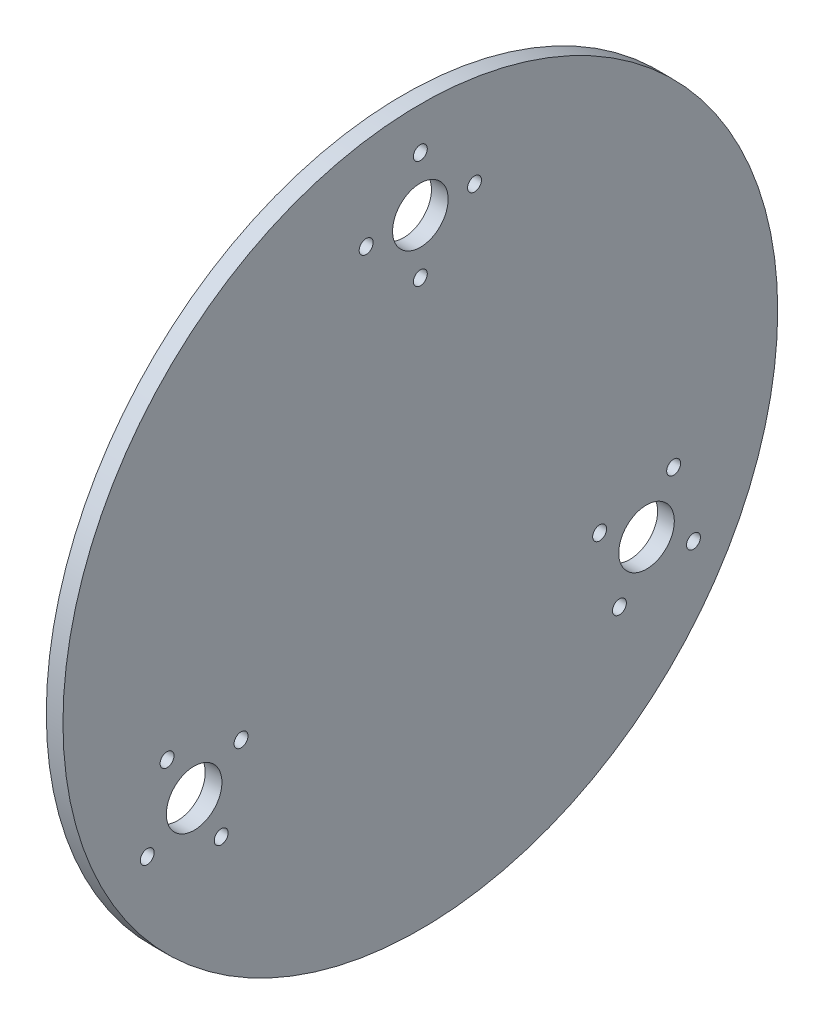
ISO-10303-21;
HEADER;
FILE_DESCRIPTION(('STEP AP214'),'2;1');
FILE_NAME('part.step','',(''),(''),'','','');
FILE_SCHEMA(('AUTOMOTIVE_DESIGN { 1 0 10303 214 1 1 1 1 }'));
ENDSEC;
DATA;
#1=APPLICATION_CONTEXT('core data for automotive mechanical design processes');
#2=APPLICATION_PROTOCOL_DEFINITION('international standard','automotive_design',2000,#1);
#3=PRODUCT_CONTEXT('',#1,'mechanical');
#4=PRODUCT('Part','Part','',(#3));
#5=PRODUCT_RELATED_PRODUCT_CATEGORY('part','',(#4));
#6=PRODUCT_DEFINITION_FORMATION('','',#4);
#7=PRODUCT_DEFINITION_CONTEXT('part definition',#1,'design');
#8=PRODUCT_DEFINITION('design','',#6,#7);
#9=PRODUCT_DEFINITION_SHAPE('','',#8);
#10=(LENGTH_UNIT() NAMED_UNIT(*) SI_UNIT(.MILLI.,.METRE.));
#11=(NAMED_UNIT(*) PLANE_ANGLE_UNIT() SI_UNIT($,.RADIAN.));
#12=(NAMED_UNIT(*) SI_UNIT($,.STERADIAN.) SOLID_ANGLE_UNIT());
#13=UNCERTAINTY_MEASURE_WITH_UNIT(LENGTH_MEASURE(1.E-05),#10,'distance_accuracy_value','');
#14=(GEOMETRIC_REPRESENTATION_CONTEXT(3) GLOBAL_UNCERTAINTY_ASSIGNED_CONTEXT((#13)) GLOBAL_UNIT_ASSIGNED_CONTEXT((#10,
#11,#12)) REPRESENTATION_CONTEXT('',''));
#15=CARTESIAN_POINT('',(0.,0.,0.));
#16=DIRECTION('',(0.,0.,1.));
#17=DIRECTION('',(1.,0.,0.));
#18=AXIS2_PLACEMENT_3D('',#15,#16,#17);
#19=CARTESIAN_POINT('',(3.,0.,0.));
#20=DIRECTION('',(1.,0.,0.));
#21=DIRECTION('',(0.,0.,-1.));
#22=AXIS2_PLACEMENT_3D('',#19,#20,#21);
#23=PLANE('',#22);
#24=CARTESIAN_POINT('',(3.,-18.6250000000015,32.2594462909677));
#25=DIRECTION('',(1.,0.,0.));
#26=DIRECTION('',(0.,0.,-1.));
#27=AXIS2_PLACEMENT_3D('',#24,#25,#26);
#28=CIRCLE('',#27,1.25);
#29=CARTESIAN_POINT('',(3.,-18.6250000000015,31.0094462909677));
#30=VERTEX_POINT('',#29);
#31=EDGE_CURVE('E123',#30,#30,#28,.T.);
#32=ORIENTED_EDGE('',*,*,#31,.F.);
#33=EDGE_LOOP('',(#32));
#34=FACE_BOUND('',#33,.T.);
#35=CARTESIAN_POINT('',(3.,-28.3750000000015,49.1469416647642));
#36=DIRECTION('',(1.,0.,0.));
#37=DIRECTION('',(0.,0.,-1.));
#38=AXIS2_PLACEMENT_3D('',#35,#36,#37);
#39=CIRCLE('',#38,1.25);
#40=CARTESIAN_POINT('',(3.,-28.3750000000015,47.8969416647642));
#41=VERTEX_POINT('',#40);
#42=EDGE_CURVE('E111',#41,#41,#39,.T.);
#43=ORIENTED_EDGE('',*,*,#42,.F.);
#44=EDGE_LOOP('',(#43));
#45=FACE_BOUND('',#44,.T.);
#46=CARTESIAN_POINT('',(3.,-15.0562523131002,-45.5781939778713));
#47=DIRECTION('',(1.,0.,0.));
#48=DIRECTION('',(0.,0.,-1.));
#49=AXIS2_PLACEMENT_3D('',#46,#47,#48);
#50=CIRCLE('',#49,1.25);
#51=CARTESIAN_POINT('',(3.,-15.0562523131002,-46.8281939778713));
#52=VERTEX_POINT('',#51);
#53=EDGE_CURVE('E99',#52,#52,#50,.T.);
#54=ORIENTED_EDGE('',*,*,#53,.F.);
#55=EDGE_LOOP('',(#54));
#56=FACE_BOUND('',#55,.T.);
#57=CARTESIAN_POINT('',(3.,47.,9.75));
#58=DIRECTION('',(1.,0.,0.));
#59=DIRECTION('',(0.,0.,-1.));
#60=AXIS2_PLACEMENT_3D('',#57,#58,#59);
#61=CIRCLE('',#60,1.25);
#62=CARTESIAN_POINT('',(3.,47.,8.5));
#63=VERTEX_POINT('',#62);
#64=EDGE_CURVE('E87',#63,#63,#61,.T.);
#65=ORIENTED_EDGE('',*,*,#64,.F.);
#66=EDGE_LOOP('',(#65));
#67=FACE_BOUND('',#66,.T.);
#68=CARTESIAN_POINT('',(3.,47.,-9.75));
#69=DIRECTION('',(1.,0.,0.));
#70=DIRECTION('',(0.,0.,-1.));
#71=AXIS2_PLACEMENT_3D('',#68,#69,#70);
#72=CIRCLE('',#71,1.25);
#73=CARTESIAN_POINT('',(3.,47.,-11.));
#74=VERTEX_POINT('',#73);
#75=EDGE_CURVE('E75',#74,#74,#72,.T.);
#76=ORIENTED_EDGE('',*,*,#75,.F.);
#77=EDGE_LOOP('',(#76));
#78=FACE_BOUND('',#77,.T.);
#79=CARTESIAN_POINT('',(3.,-28.3749999999985,-49.1469416647695));
#80=DIRECTION('',(1.,0.,0.));
#81=DIRECTION('',(0.,0.,-1.));
#82=AXIS2_PLACEMENT_3D('',#79,#80,#81);
#83=CIRCLE('',#82,1.25);
#84=CARTESIAN_POINT('',(3.,-28.3749999999985,-50.3969416647695));
#85=VERTEX_POINT('',#84);
#86=EDGE_CURVE('E63',#85,#85,#83,.T.);
#87=ORIENTED_EDGE('',*,*,#86,.F.);
#88=EDGE_LOOP('',(#87));
#89=FACE_BOUND('',#88,.T.);
#90=CARTESIAN_POINT('',(3.,-23.4999999999985,-40.7031939778713));
#91=DIRECTION('',(1.,0.,0.));
#92=DIRECTION('',(0.,0.,-1.));
#93=AXIS2_PLACEMENT_3D('',#90,#91,#92);
#94=CIRCLE('',#93,5.);
#95=CARTESIAN_POINT('',(3.,-23.4999999999985,-45.7031939778713));
#96=VERTEX_POINT('',#95);
#97=EDGE_CURVE('E51',#96,#96,#94,.T.);
#98=ORIENTED_EDGE('',*,*,#97,.F.);
#99=EDGE_LOOP('',(#98));
#100=FACE_BOUND('',#99,.T.);
#101=CARTESIAN_POINT('',(3.,0.,0.));
#102=DIRECTION('',(1.,0.,0.));
#103=DIRECTION('',(0.,0.,-1.));
#104=AXIS2_PLACEMENT_3D('',#101,#102,#103);
#105=CIRCLE('',#104,64.3085896706992);
#106=CARTESIAN_POINT('',(3.,0.,-64.3085896706992));
#107=VERTEX_POINT('',#106);
#108=EDGE_CURVE('E10',#107,#107,#105,.T.);
#109=ORIENTED_EDGE('',*,*,#108,.T.);
#110=EDGE_LOOP('',(#109));
#111=FACE_BOUND('',#110,.T.);
#112=CARTESIAN_POINT('',(3.,47.,0.));
#113=DIRECTION('',(1.,0.,0.));
#114=DIRECTION('',(0.,0.,-1.));
#115=AXIS2_PLACEMENT_3D('',#112,#113,#114);
#116=CIRCLE('',#115,5.);
#117=CARTESIAN_POINT('',(3.,47.,-5.));
#118=VERTEX_POINT('',#117);
#119=EDGE_CURVE('E46',#118,#118,#116,.T.);
#120=ORIENTED_EDGE('',*,*,#119,.F.);
#121=EDGE_LOOP('',(#120));
#122=FACE_BOUND('',#121,.T.);
#123=CARTESIAN_POINT('',(3.,56.75,0.));
#124=DIRECTION('',(1.,0.,0.));
#125=DIRECTION('',(0.,0.,-1.));
#126=AXIS2_PLACEMENT_3D('',#123,#124,#125);
#127=CIRCLE('',#126,1.25);
#128=CARTESIAN_POINT('',(3.,56.75,-1.25));
#129=VERTEX_POINT('',#128);
#130=EDGE_CURVE('E57',#129,#129,#127,.T.);
#131=ORIENTED_EDGE('',*,*,#130,.F.);
#132=EDGE_LOOP('',(#131));
#133=FACE_BOUND('',#132,.T.);
#134=CARTESIAN_POINT('',(3.,-31.9437476868968,-35.8281939778713));
#135=DIRECTION('',(1.,0.,0.));
#136=DIRECTION('',(0.,0.,-1.));
#137=AXIS2_PLACEMENT_3D('',#134,#135,#136);
#138=CIRCLE('',#137,1.25);
#139=CARTESIAN_POINT('',(3.,-31.9437476868968,-37.0781939778713));
#140=VERTEX_POINT('',#139);
#141=EDGE_CURVE('E69',#140,#140,#138,.T.);
#142=ORIENTED_EDGE('',*,*,#141,.F.);
#143=EDGE_LOOP('',(#142));
#144=FACE_BOUND('',#143,.T.);
#145=CARTESIAN_POINT('',(3.,37.25,0.));
#146=DIRECTION('',(1.,0.,0.));
#147=DIRECTION('',(0.,0.,-1.));
#148=AXIS2_PLACEMENT_3D('',#145,#146,#147);
#149=CIRCLE('',#148,1.25);
#150=CARTESIAN_POINT('',(3.,37.25,-1.25));
#151=VERTEX_POINT('',#150);
#152=EDGE_CURVE('E81',#151,#151,#149,.T.);
#153=ORIENTED_EDGE('',*,*,#152,.F.);
#154=EDGE_LOOP('',(#153));
#155=FACE_BOUND('',#154,.T.);
#156=CARTESIAN_POINT('',(3.,-18.6249999999985,-32.259446290973));
#157=DIRECTION('',(1.,0.,0.));
#158=DIRECTION('',(0.,0.,-1.));
#159=AXIS2_PLACEMENT_3D('',#156,#157,#158);
#160=CIRCLE('',#159,1.25);
#161=CARTESIAN_POINT('',(3.,-18.6249999999985,-33.509446290973));
#162=VERTEX_POINT('',#161);
#163=EDGE_CURVE('E93',#162,#162,#160,.T.);
#164=ORIENTED_EDGE('',*,*,#163,.F.);
#165=EDGE_LOOP('',(#164));
#166=FACE_BOUND('',#165,.T.);
#167=CARTESIAN_POINT('',(3.,-23.5000000000015,40.703193977866));
#168=DIRECTION('',(1.,0.,0.));
#169=DIRECTION('',(0.,0.,-1.));
#170=AXIS2_PLACEMENT_3D('',#167,#168,#169);
#171=CIRCLE('',#170,5.);
#172=CARTESIAN_POINT('',(3.,-23.5000000000015,35.703193977866));
#173=VERTEX_POINT('',#172);
#174=EDGE_CURVE('E105',#173,#173,#171,.T.);
#175=ORIENTED_EDGE('',*,*,#174,.F.);
#176=EDGE_LOOP('',(#175));
#177=FACE_BOUND('',#176,.T.);
#178=CARTESIAN_POINT('',(3.,-15.0562523131033,45.578193977866));
#179=DIRECTION('',(1.,0.,0.));
#180=DIRECTION('',(0.,0.,-1.));
#181=AXIS2_PLACEMENT_3D('',#178,#179,#180);
#182=CIRCLE('',#181,1.25000000000001);
#183=CARTESIAN_POINT('',(3.,-15.0562523131033,44.328193977866));
#184=VERTEX_POINT('',#183);
#185=EDGE_CURVE('E117',#184,#184,#182,.T.);
#186=ORIENTED_EDGE('',*,*,#185,.F.);
#187=EDGE_LOOP('',(#186));
#188=FACE_BOUND('',#187,.T.);
#189=CARTESIAN_POINT('',(3.,-31.9437476868998,35.828193977866));
#190=DIRECTION('',(1.,0.,0.));
#191=DIRECTION('',(0.,0.,-1.));
#192=AXIS2_PLACEMENT_3D('',#189,#190,#191);
#193=CIRCLE('',#192,1.25);
#194=CARTESIAN_POINT('',(3.,-31.9437476868998,34.578193977866));
#195=VERTEX_POINT('',#194);
#196=EDGE_CURVE('E129',#195,#195,#193,.T.);
#197=ORIENTED_EDGE('',*,*,#196,.F.);
#198=EDGE_LOOP('',(#197));
#199=FACE_BOUND('',#198,.T.);
#200=ADVANCED_FACE('F35',(#34,#45,#56,#67,#78,#89,#100,#111,#122,#133,#144,#155,#166,#177,#188,
#199),#23,.T.);
#201=CARTESIAN_POINT('',(0.,0.,0.));
#202=DIRECTION('',(1.,0.,0.));
#203=DIRECTION('',(0.,0.,-1.));
#204=AXIS2_PLACEMENT_3D('',#201,#202,#203);
#205=PLANE('',#204);
#206=CARTESIAN_POINT('',(0.,0.,0.));
#207=DIRECTION('',(1.,0.,0.));
#208=DIRECTION('',(0.,0.,-1.));
#209=AXIS2_PLACEMENT_3D('',#206,#207,#208);
#210=CIRCLE('',#209,64.3085896706992);
#211=CARTESIAN_POINT('',(0.,0.,-64.3085896706992));
#212=VERTEX_POINT('',#211);
#213=EDGE_CURVE('E39',#212,#212,#210,.T.);
#214=ORIENTED_EDGE('',*,*,#213,.F.);
#215=EDGE_LOOP('',(#214));
#216=FACE_BOUND('',#215,.T.);
#217=CARTESIAN_POINT('',(0.,47.,0.));
#218=DIRECTION('',(1.,0.,0.));
#219=DIRECTION('',(0.,0.,-1.));
#220=AXIS2_PLACEMENT_3D('',#217,#218,#219);
#221=CIRCLE('',#220,5.);
#222=CARTESIAN_POINT('',(0.,47.,-5.));
#223=VERTEX_POINT('',#222);
#224=EDGE_CURVE('E48',#223,#223,#221,.T.);
#225=ORIENTED_EDGE('',*,*,#224,.T.);
#226=EDGE_LOOP('',(#225));
#227=FACE_BOUND('',#226,.T.);
#228=CARTESIAN_POINT('',(0.,-23.4999999999985,-40.7031939778713));
#229=DIRECTION('',(1.,0.,0.));
#230=DIRECTION('',(0.,0.,-1.));
#231=AXIS2_PLACEMENT_3D('',#228,#229,#230);
#232=CIRCLE('',#231,5.);
#233=CARTESIAN_POINT('',(0.,-23.4999999999985,-45.7031939778713));
#234=VERTEX_POINT('',#233);
#235=EDGE_CURVE('E54',#234,#234,#232,.T.);
#236=ORIENTED_EDGE('',*,*,#235,.T.);
#237=EDGE_LOOP('',(#236));
#238=FACE_BOUND('',#237,.T.);
#239=CARTESIAN_POINT('',(0.,56.75,0.));
#240=DIRECTION('',(1.,0.,0.));
#241=DIRECTION('',(0.,0.,-1.));
#242=AXIS2_PLACEMENT_3D('',#239,#240,#241);
#243=CIRCLE('',#242,1.25);
#244=CARTESIAN_POINT('',(0.,56.75,-1.25));
#245=VERTEX_POINT('',#244);
#246=EDGE_CURVE('E60',#245,#245,#243,.T.);
#247=ORIENTED_EDGE('',*,*,#246,.T.);
#248=EDGE_LOOP('',(#247));
#249=FACE_BOUND('',#248,.T.);
#250=CARTESIAN_POINT('',(0.,-28.3749999999985,-49.1469416647695));
#251=DIRECTION('',(1.,0.,0.));
#252=DIRECTION('',(0.,0.,-1.));
#253=AXIS2_PLACEMENT_3D('',#250,#251,#252);
#254=CIRCLE('',#253,1.25);
#255=CARTESIAN_POINT('',(0.,-28.3749999999985,-50.3969416647695));
#256=VERTEX_POINT('',#255);
#257=EDGE_CURVE('E66',#256,#256,#254,.T.);
#258=ORIENTED_EDGE('',*,*,#257,.T.);
#259=EDGE_LOOP('',(#258));
#260=FACE_BOUND('',#259,.T.);
#261=CARTESIAN_POINT('',(0.,-31.9437476868968,-35.8281939778713));
#262=DIRECTION('',(1.,0.,0.));
#263=DIRECTION('',(0.,0.,-1.));
#264=AXIS2_PLACEMENT_3D('',#261,#262,#263);
#265=CIRCLE('',#264,1.25);
#266=CARTESIAN_POINT('',(0.,-31.9437476868968,-37.0781939778713));
#267=VERTEX_POINT('',#266);
#268=EDGE_CURVE('E72',#267,#267,#265,.T.);
#269=ORIENTED_EDGE('',*,*,#268,.T.);
#270=EDGE_LOOP('',(#269));
#271=FACE_BOUND('',#270,.T.);
#272=CARTESIAN_POINT('',(0.,47.,-9.75));
#273=DIRECTION('',(1.,0.,0.));
#274=DIRECTION('',(0.,0.,-1.));
#275=AXIS2_PLACEMENT_3D('',#272,#273,#274);
#276=CIRCLE('',#275,1.25);
#277=CARTESIAN_POINT('',(0.,47.,-11.));
#278=VERTEX_POINT('',#277);
#279=EDGE_CURVE('E78',#278,#278,#276,.T.);
#280=ORIENTED_EDGE('',*,*,#279,.T.);
#281=EDGE_LOOP('',(#280));
#282=FACE_BOUND('',#281,.T.);
#283=CARTESIAN_POINT('',(0.,37.25,0.));
#284=DIRECTION('',(1.,0.,0.));
#285=DIRECTION('',(0.,0.,-1.));
#286=AXIS2_PLACEMENT_3D('',#283,#284,#285);
#287=CIRCLE('',#286,1.25);
#288=CARTESIAN_POINT('',(0.,37.25,-1.25));
#289=VERTEX_POINT('',#288);
#290=EDGE_CURVE('E84',#289,#289,#287,.T.);
#291=ORIENTED_EDGE('',*,*,#290,.T.);
#292=EDGE_LOOP('',(#291));
#293=FACE_BOUND('',#292,.T.);
#294=CARTESIAN_POINT('',(0.,47.,9.75));
#295=DIRECTION('',(1.,0.,0.));
#296=DIRECTION('',(0.,0.,-1.));
#297=AXIS2_PLACEMENT_3D('',#294,#295,#296);
#298=CIRCLE('',#297,1.25);
#299=CARTESIAN_POINT('',(0.,47.,8.5));
#300=VERTEX_POINT('',#299);
#301=EDGE_CURVE('E90',#300,#300,#298,.T.);
#302=ORIENTED_EDGE('',*,*,#301,.T.);
#303=EDGE_LOOP('',(#302));
#304=FACE_BOUND('',#303,.T.);
#305=CARTESIAN_POINT('',(0.,-18.6249999999985,-32.259446290973));
#306=DIRECTION('',(1.,0.,0.));
#307=DIRECTION('',(0.,0.,-1.));
#308=AXIS2_PLACEMENT_3D('',#305,#306,#307);
#309=CIRCLE('',#308,1.25);
#310=CARTESIAN_POINT('',(0.,-18.6249999999985,-33.509446290973));
#311=VERTEX_POINT('',#310);
#312=EDGE_CURVE('E96',#311,#311,#309,.T.);
#313=ORIENTED_EDGE('',*,*,#312,.T.);
#314=EDGE_LOOP('',(#313));
#315=FACE_BOUND('',#314,.T.);
#316=CARTESIAN_POINT('',(0.,-15.0562523131002,-45.5781939778713));
#317=DIRECTION('',(1.,0.,0.));
#318=DIRECTION('',(0.,0.,-1.));
#319=AXIS2_PLACEMENT_3D('',#316,#317,#318);
#320=CIRCLE('',#319,1.25);
#321=CARTESIAN_POINT('',(0.,-15.0562523131002,-46.8281939778713));
#322=VERTEX_POINT('',#321);
#323=EDGE_CURVE('E102',#322,#322,#320,.T.);
#324=ORIENTED_EDGE('',*,*,#323,.T.);
#325=EDGE_LOOP('',(#324));
#326=FACE_BOUND('',#325,.T.);
#327=CARTESIAN_POINT('',(0.,-23.5000000000015,40.703193977866));
#328=DIRECTION('',(1.,0.,0.));
#329=DIRECTION('',(0.,0.,-1.));
#330=AXIS2_PLACEMENT_3D('',#327,#328,#329);
#331=CIRCLE('',#330,5.);
#332=CARTESIAN_POINT('',(0.,-23.5000000000015,35.703193977866));
#333=VERTEX_POINT('',#332);
#334=EDGE_CURVE('E108',#333,#333,#331,.T.);
#335=ORIENTED_EDGE('',*,*,#334,.T.);
#336=EDGE_LOOP('',(#335));
#337=FACE_BOUND('',#336,.T.);
#338=CARTESIAN_POINT('',(0.,-28.3750000000015,49.1469416647642));
#339=DIRECTION('',(1.,0.,0.));
#340=DIRECTION('',(0.,0.,-1.));
#341=AXIS2_PLACEMENT_3D('',#338,#339,#340);
#342=CIRCLE('',#341,1.25);
#343=CARTESIAN_POINT('',(0.,-28.3750000000015,47.8969416647642));
#344=VERTEX_POINT('',#343);
#345=EDGE_CURVE('E114',#344,#344,#342,.T.);
#346=ORIENTED_EDGE('',*,*,#345,.T.);
#347=EDGE_LOOP('',(#346));
#348=FACE_BOUND('',#347,.T.);
#349=CARTESIAN_POINT('',(0.,-15.0562523131033,45.578193977866));
#350=DIRECTION('',(1.,0.,0.));
#351=DIRECTION('',(0.,0.,-1.));
#352=AXIS2_PLACEMENT_3D('',#349,#350,#351);
#353=CIRCLE('',#352,1.25000000000001);
#354=CARTESIAN_POINT('',(0.,-15.0562523131033,44.328193977866));
#355=VERTEX_POINT('',#354);
#356=EDGE_CURVE('E120',#355,#355,#353,.T.);
#357=ORIENTED_EDGE('',*,*,#356,.T.);
#358=EDGE_LOOP('',(#357));
#359=FACE_BOUND('',#358,.T.);
#360=CARTESIAN_POINT('',(0.,-18.6250000000015,32.2594462909677));
#361=DIRECTION('',(1.,0.,0.));
#362=DIRECTION('',(0.,0.,-1.));
#363=AXIS2_PLACEMENT_3D('',#360,#361,#362);
#364=CIRCLE('',#363,1.25);
#365=CARTESIAN_POINT('',(0.,-18.6250000000015,31.0094462909677));
#366=VERTEX_POINT('',#365);
#367=EDGE_CURVE('E126',#366,#366,#364,.T.);
#368=ORIENTED_EDGE('',*,*,#367,.T.);
#369=EDGE_LOOP('',(#368));
#370=FACE_BOUND('',#369,.T.);
#371=CARTESIAN_POINT('',(0.,-31.9437476868998,35.828193977866));
#372=DIRECTION('',(1.,0.,0.));
#373=DIRECTION('',(0.,0.,-1.));
#374=AXIS2_PLACEMENT_3D('',#371,#372,#373);
#375=CIRCLE('',#374,1.25);
#376=CARTESIAN_POINT('',(0.,-31.9437476868998,34.578193977866));
#377=VERTEX_POINT('',#376);
#378=EDGE_CURVE('E132',#377,#377,#375,.T.);
#379=ORIENTED_EDGE('',*,*,#378,.T.);
#380=EDGE_LOOP('',(#379));
#381=FACE_BOUND('',#380,.T.);
#382=ADVANCED_FACE('F142',(#216,#227,#238,#249,#260,#271,#282,#293,#304,#315,#326,#337,#348,
#359,#370,#381),#205,.F.);
#383=CARTESIAN_POINT('',(3.,0.,0.));
#384=DIRECTION('',(-1.,0.,0.));
#385=DIRECTION('',(0.,0.,1.));
#386=AXIS2_PLACEMENT_3D('',#383,#384,#385);
#387=CYLINDRICAL_SURFACE('',#386,64.3085896706992);
#388=ORIENTED_EDGE('',*,*,#108,.F.);
#389=EDGE_LOOP('',(#388));
#390=FACE_BOUND('',#389,.T.);
#391=ORIENTED_EDGE('',*,*,#213,.T.);
#392=EDGE_LOOP('',(#391));
#393=FACE_BOUND('',#392,.T.);
#394=ADVANCED_FACE('F37',(#390,#393),#387,.T.);
#395=CARTESIAN_POINT('',(3.,47.,0.));
#396=DIRECTION('',(-1.,0.,0.));
#397=DIRECTION('',(0.,0.,1.));
#398=AXIS2_PLACEMENT_3D('',#395,#396,#397);
#399=CYLINDRICAL_SURFACE('',#398,5.);
#400=ORIENTED_EDGE('',*,*,#119,.T.);
#401=EDGE_LOOP('',(#400));
#402=FACE_BOUND('',#401,.T.);
#403=ORIENTED_EDGE('',*,*,#224,.F.);
#404=EDGE_LOOP('',(#403));
#405=FACE_BOUND('',#404,.T.);
#406=ADVANCED_FACE('F152',(#402,#405),#399,.F.);
#407=CARTESIAN_POINT('',(3.,-23.4999999999985,-40.7031939778713));
#408=DIRECTION('',(-1.,0.,0.));
#409=DIRECTION('',(0.,0.,1.));
#410=AXIS2_PLACEMENT_3D('',#407,#408,#409);
#411=CYLINDRICAL_SURFACE('',#410,5.);
#412=ORIENTED_EDGE('',*,*,#97,.T.);
#413=EDGE_LOOP('',(#412));
#414=FACE_BOUND('',#413,.T.);
#415=ORIENTED_EDGE('',*,*,#235,.F.);
#416=EDGE_LOOP('',(#415));
#417=FACE_BOUND('',#416,.T.);
#418=ADVANCED_FACE('F155',(#414,#417),#411,.F.);
#419=CARTESIAN_POINT('',(3.,56.75,0.));
#420=DIRECTION('',(-1.,0.,0.));
#421=DIRECTION('',(0.,0.,1.));
#422=AXIS2_PLACEMENT_3D('',#419,#420,#421);
#423=CYLINDRICAL_SURFACE('',#422,1.25);
#424=ORIENTED_EDGE('',*,*,#130,.T.);
#425=EDGE_LOOP('',(#424));
#426=FACE_BOUND('',#425,.T.);
#427=ORIENTED_EDGE('',*,*,#246,.F.);
#428=EDGE_LOOP('',(#427));
#429=FACE_BOUND('',#428,.T.);
#430=ADVANCED_FACE('F159',(#426,#429),#423,.F.);
#431=CARTESIAN_POINT('',(3.,-28.3749999999985,-49.1469416647695));
#432=DIRECTION('',(-1.,0.,0.));
#433=DIRECTION('',(0.,0.,1.));
#434=AXIS2_PLACEMENT_3D('',#431,#432,#433);
#435=CYLINDRICAL_SURFACE('',#434,1.25);
#436=ORIENTED_EDGE('',*,*,#86,.T.);
#437=EDGE_LOOP('',(#436));
#438=FACE_BOUND('',#437,.T.);
#439=ORIENTED_EDGE('',*,*,#257,.F.);
#440=EDGE_LOOP('',(#439));
#441=FACE_BOUND('',#440,.T.);
#442=ADVANCED_FACE('F163',(#438,#441),#435,.F.);
#443=CARTESIAN_POINT('',(3.,-31.9437476868968,-35.8281939778713));
#444=DIRECTION('',(-1.,0.,0.));
#445=DIRECTION('',(0.,0.,1.));
#446=AXIS2_PLACEMENT_3D('',#443,#444,#445);
#447=CYLINDRICAL_SURFACE('',#446,1.25);
#448=ORIENTED_EDGE('',*,*,#141,.T.);
#449=EDGE_LOOP('',(#448));
#450=FACE_BOUND('',#449,.T.);
#451=ORIENTED_EDGE('',*,*,#268,.F.);
#452=EDGE_LOOP('',(#451));
#453=FACE_BOUND('',#452,.T.);
#454=ADVANCED_FACE('F167',(#450,#453),#447,.F.);
#455=CARTESIAN_POINT('',(3.,47.,-9.75));
#456=DIRECTION('',(-1.,0.,0.));
#457=DIRECTION('',(0.,0.,1.));
#458=AXIS2_PLACEMENT_3D('',#455,#456,#457);
#459=CYLINDRICAL_SURFACE('',#458,1.25);
#460=ORIENTED_EDGE('',*,*,#75,.T.);
#461=EDGE_LOOP('',(#460));
#462=FACE_BOUND('',#461,.T.);
#463=ORIENTED_EDGE('',*,*,#279,.F.);
#464=EDGE_LOOP('',(#463));
#465=FACE_BOUND('',#464,.T.);
#466=ADVANCED_FACE('F171',(#462,#465),#459,.F.);
#467=CARTESIAN_POINT('',(3.,37.25,0.));
#468=DIRECTION('',(-1.,0.,0.));
#469=DIRECTION('',(0.,0.,1.));
#470=AXIS2_PLACEMENT_3D('',#467,#468,#469);
#471=CYLINDRICAL_SURFACE('',#470,1.25);
#472=ORIENTED_EDGE('',*,*,#152,.T.);
#473=EDGE_LOOP('',(#472));
#474=FACE_BOUND('',#473,.T.);
#475=ORIENTED_EDGE('',*,*,#290,.F.);
#476=EDGE_LOOP('',(#475));
#477=FACE_BOUND('',#476,.T.);
#478=ADVANCED_FACE('F175',(#474,#477),#471,.F.);
#479=CARTESIAN_POINT('',(3.,47.,9.75));
#480=DIRECTION('',(-1.,0.,0.));
#481=DIRECTION('',(0.,0.,1.));
#482=AXIS2_PLACEMENT_3D('',#479,#480,#481);
#483=CYLINDRICAL_SURFACE('',#482,1.25);
#484=ORIENTED_EDGE('',*,*,#64,.T.);
#485=EDGE_LOOP('',(#484));
#486=FACE_BOUND('',#485,.T.);
#487=ORIENTED_EDGE('',*,*,#301,.F.);
#488=EDGE_LOOP('',(#487));
#489=FACE_BOUND('',#488,.T.);
#490=ADVANCED_FACE('F179',(#486,#489),#483,.F.);
#491=CARTESIAN_POINT('',(3.,-18.6249999999985,-32.259446290973));
#492=DIRECTION('',(-1.,0.,0.));
#493=DIRECTION('',(0.,0.,1.));
#494=AXIS2_PLACEMENT_3D('',#491,#492,#493);
#495=CYLINDRICAL_SURFACE('',#494,1.25);
#496=ORIENTED_EDGE('',*,*,#163,.T.);
#497=EDGE_LOOP('',(#496));
#498=FACE_BOUND('',#497,.T.);
#499=ORIENTED_EDGE('',*,*,#312,.F.);
#500=EDGE_LOOP('',(#499));
#501=FACE_BOUND('',#500,.T.);
#502=ADVANCED_FACE('F183',(#498,#501),#495,.F.);
#503=CARTESIAN_POINT('',(3.,-15.0562523131002,-45.5781939778713));
#504=DIRECTION('',(-1.,0.,0.));
#505=DIRECTION('',(0.,0.,1.));
#506=AXIS2_PLACEMENT_3D('',#503,#504,#505);
#507=CYLINDRICAL_SURFACE('',#506,1.25);
#508=ORIENTED_EDGE('',*,*,#53,.T.);
#509=EDGE_LOOP('',(#508));
#510=FACE_BOUND('',#509,.T.);
#511=ORIENTED_EDGE('',*,*,#323,.F.);
#512=EDGE_LOOP('',(#511));
#513=FACE_BOUND('',#512,.T.);
#514=ADVANCED_FACE('F187',(#510,#513),#507,.F.);
#515=CARTESIAN_POINT('',(3.,-23.5000000000015,40.703193977866));
#516=DIRECTION('',(-1.,0.,0.));
#517=DIRECTION('',(0.,0.,1.));
#518=AXIS2_PLACEMENT_3D('',#515,#516,#517);
#519=CYLINDRICAL_SURFACE('',#518,5.);
#520=ORIENTED_EDGE('',*,*,#174,.T.);
#521=EDGE_LOOP('',(#520));
#522=FACE_BOUND('',#521,.T.);
#523=ORIENTED_EDGE('',*,*,#334,.F.);
#524=EDGE_LOOP('',(#523));
#525=FACE_BOUND('',#524,.T.);
#526=ADVANCED_FACE('F191',(#522,#525),#519,.F.);
#527=CARTESIAN_POINT('',(3.,-28.3750000000015,49.1469416647642));
#528=DIRECTION('',(-1.,0.,0.));
#529=DIRECTION('',(0.,0.,1.));
#530=AXIS2_PLACEMENT_3D('',#527,#528,#529);
#531=CYLINDRICAL_SURFACE('',#530,1.25);
#532=ORIENTED_EDGE('',*,*,#42,.T.);
#533=EDGE_LOOP('',(#532));
#534=FACE_BOUND('',#533,.T.);
#535=ORIENTED_EDGE('',*,*,#345,.F.);
#536=EDGE_LOOP('',(#535));
#537=FACE_BOUND('',#536,.T.);
#538=ADVANCED_FACE('F195',(#534,#537),#531,.F.);
#539=CARTESIAN_POINT('',(3.,-15.0562523131033,45.578193977866));
#540=DIRECTION('',(-1.,0.,0.));
#541=DIRECTION('',(0.,0.,1.));
#542=AXIS2_PLACEMENT_3D('',#539,#540,#541);
#543=CYLINDRICAL_SURFACE('',#542,1.25000000000001);
#544=ORIENTED_EDGE('',*,*,#185,.T.);
#545=EDGE_LOOP('',(#544));
#546=FACE_BOUND('',#545,.T.);
#547=ORIENTED_EDGE('',*,*,#356,.F.);
#548=EDGE_LOOP('',(#547));
#549=FACE_BOUND('',#548,.T.);
#550=ADVANCED_FACE('F199',(#546,#549),#543,.F.);
#551=CARTESIAN_POINT('',(3.,-18.6250000000015,32.2594462909677));
#552=DIRECTION('',(-1.,0.,0.));
#553=DIRECTION('',(0.,0.,1.));
#554=AXIS2_PLACEMENT_3D('',#551,#552,#553);
#555=CYLINDRICAL_SURFACE('',#554,1.25);
#556=ORIENTED_EDGE('',*,*,#31,.T.);
#557=EDGE_LOOP('',(#556));
#558=FACE_BOUND('',#557,.T.);
#559=ORIENTED_EDGE('',*,*,#367,.F.);
#560=EDGE_LOOP('',(#559));
#561=FACE_BOUND('',#560,.T.);
#562=ADVANCED_FACE('F203',(#558,#561),#555,.F.);
#563=CARTESIAN_POINT('',(3.,-31.9437476868998,35.828193977866));
#564=DIRECTION('',(-1.,0.,0.));
#565=DIRECTION('',(0.,0.,1.));
#566=AXIS2_PLACEMENT_3D('',#563,#564,#565);
#567=CYLINDRICAL_SURFACE('',#566,1.25);
#568=ORIENTED_EDGE('',*,*,#196,.T.);
#569=EDGE_LOOP('',(#568));
#570=FACE_BOUND('',#569,.T.);
#571=ORIENTED_EDGE('',*,*,#378,.F.);
#572=EDGE_LOOP('',(#571));
#573=FACE_BOUND('',#572,.T.);
#574=ADVANCED_FACE('F138',(#570,#573),#567,.F.);
#575=CLOSED_SHELL('',(#200,#382,#394,#406,#418,#430,#442,#454,#466,#478,#490,#502,#514,#526,
#538,#550,#562,#574));
#576=MANIFOLD_SOLID_BREP('B2',#575);
#577=ADVANCED_BREP_SHAPE_REPRESENTATION('',(#18,#576),#14);
#578=SHAPE_DEFINITION_REPRESENTATION(#9,#577);
ENDSEC;
END-ISO-10303-21;
